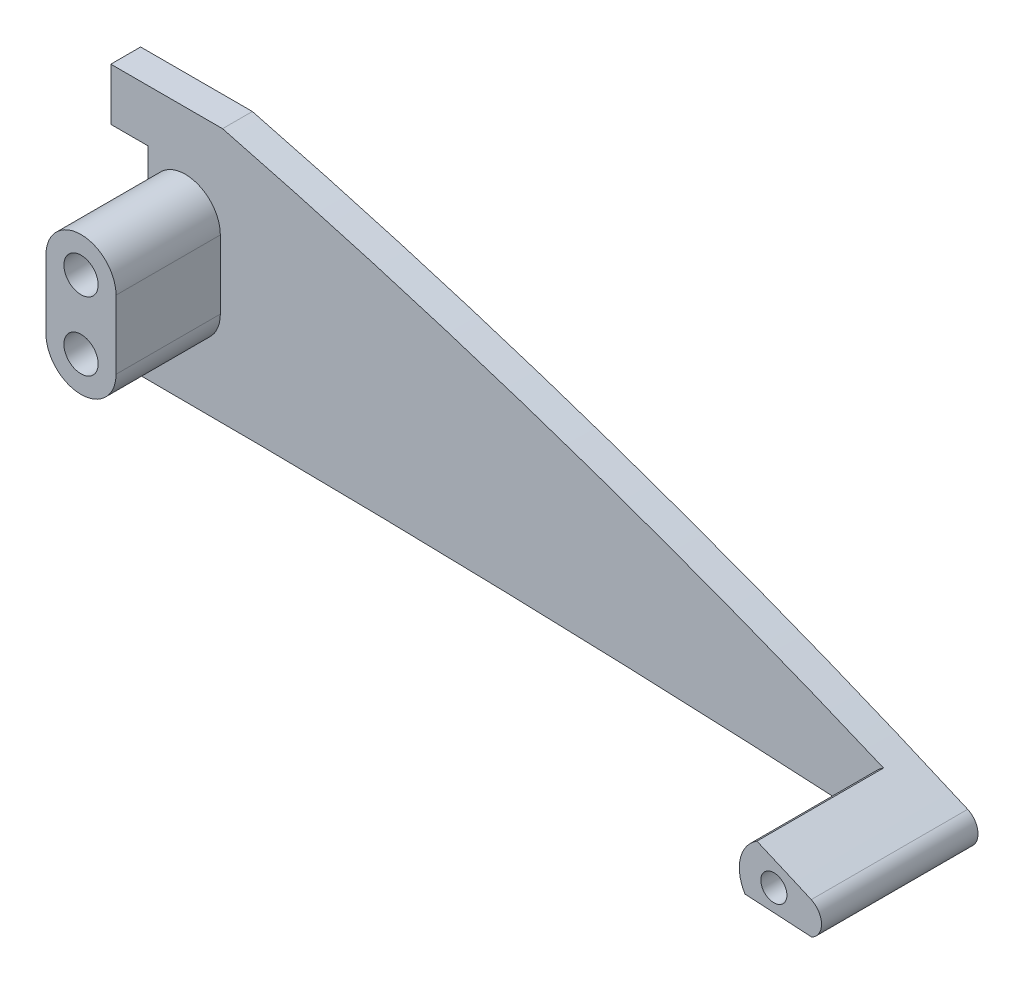
ISO-10303-21;
HEADER;
FILE_DESCRIPTION(('STEP AP214'),'2;1');
FILE_NAME('part.step','',(''),(''),'','','');
FILE_SCHEMA(('AUTOMOTIVE_DESIGN { 1 0 10303 214 1 1 1 1 }'));
ENDSEC;
DATA;
#1=APPLICATION_CONTEXT('core data for automotive mechanical design processes');
#2=APPLICATION_PROTOCOL_DEFINITION('international standard','automotive_design',2000,#1);
#3=PRODUCT_CONTEXT('',#1,'mechanical');
#4=PRODUCT('Part','Part','',(#3));
#5=PRODUCT_RELATED_PRODUCT_CATEGORY('part','',(#4));
#6=PRODUCT_DEFINITION_FORMATION('','',#4);
#7=PRODUCT_DEFINITION_CONTEXT('part definition',#1,'design');
#8=PRODUCT_DEFINITION('design','',#6,#7);
#9=PRODUCT_DEFINITION_SHAPE('','',#8);
#10=(LENGTH_UNIT() NAMED_UNIT(*) SI_UNIT(.MILLI.,.METRE.));
#11=(NAMED_UNIT(*) PLANE_ANGLE_UNIT() SI_UNIT($,.RADIAN.));
#12=(NAMED_UNIT(*) SI_UNIT($,.STERADIAN.) SOLID_ANGLE_UNIT());
#13=UNCERTAINTY_MEASURE_WITH_UNIT(LENGTH_MEASURE(1.E-05),#10,'distance_accuracy_value','');
#14=(GEOMETRIC_REPRESENTATION_CONTEXT(3) GLOBAL_UNCERTAINTY_ASSIGNED_CONTEXT((#13)) GLOBAL_UNIT_ASSIGNED_CONTEXT((#10,
#11,#12)) REPRESENTATION_CONTEXT('',''));
#15=CARTESIAN_POINT('',(0.,0.,0.));
#16=DIRECTION('',(0.,0.,1.));
#17=DIRECTION('',(1.,0.,0.));
#18=AXIS2_PLACEMENT_3D('',#15,#16,#17);
#19=CARTESIAN_POINT('',(125.2,-18.184180882781,4.));
#20=DIRECTION('',(0.,0.,-1.));
#21=DIRECTION('',(-1.,0.,0.));
#22=AXIS2_PLACEMENT_3D('',#19,#20,#21);
#23=PLANE('',#22);
#24=CARTESIAN_POINT('',(121.606035169385,-17.1322224625287,4.));
#25=DIRECTION('',(0.,0.,1.));
#26=DIRECTION('',(-1.,0.,0.));
#27=AXIS2_PLACEMENT_3D('',#24,#25,#26);
#28=CIRCLE('',#27,5.04570951350734);
#29=CARTESIAN_POINT('',(118.922411718287,-12.859360462951,4.));
#30=VERTEX_POINT('',#29);
#31=CARTESIAN_POINT('',(117.333173169808,-19.8158459136246,4.));
#32=VERTEX_POINT('',#31);
#33=EDGE_CURVE('E186',#30,#32,#28,.T.);
#34=ORIENTED_EDGE('',*,*,#33,.F.);
#35=CARTESIAN_POINT('',(-123.166643251558,-583.435959333798,4.));
#36=DIRECTION('',(0.,0.,1.));
#37=DIRECTION('',(-1.,0.,0.));
#38=AXIS2_PLACEMENT_3D('',#35,#36,#37);
#39=CIRCLE('',#38,619.810265900151);
#40=CARTESIAN_POINT('',(30.2000000000001,17.1000000000001,4.));
#41=VERTEX_POINT('',#40);
#42=EDGE_CURVE('E226',#30,#41,#39,.T.);
#43=ORIENTED_EDGE('',*,*,#42,.T.);
#44=DIRECTION('',(-1.,0.,0.));
#45=VECTOR('',#44,1.);
#46=CARTESIAN_POINT('',(15.2,17.1,4.));
#47=LINE('',#46,#45);
#48=CARTESIAN_POINT('',(15.2,17.1,4.));
#49=VERTEX_POINT('',#48);
#50=EDGE_CURVE('E229',#41,#49,#47,.T.);
#51=ORIENTED_EDGE('',*,*,#50,.T.);
#52=DIRECTION('',(0.,-1.,0.));
#53=VECTOR('',#52,1.);
#54=CARTESIAN_POINT('',(15.2,17.1,4.));
#55=LINE('',#54,#53);
#56=CARTESIAN_POINT('',(15.2,10.1,4.));
#57=VERTEX_POINT('',#56);
#58=EDGE_CURVE('E233',#49,#57,#55,.T.);
#59=ORIENTED_EDGE('',*,*,#58,.T.);
#60=DIRECTION('',(1.,0.,0.));
#61=VECTOR('',#60,1.);
#62=CARTESIAN_POINT('',(15.2,10.1,4.));
#63=LINE('',#62,#61);
#64=CARTESIAN_POINT('',(20.2,10.1,4.));
#65=VERTEX_POINT('',#64);
#66=EDGE_CURVE('E236',#57,#65,#63,.T.);
#67=ORIENTED_EDGE('',*,*,#66,.T.);
#68=DIRECTION('',(0.,-1.,0.));
#69=VECTOR('',#68,1.);
#70=CARTESIAN_POINT('',(20.2,10.1,4.));
#71=LINE('',#70,#69);
#72=CARTESIAN_POINT('',(20.2,-10.1,4.));
#73=VERTEX_POINT('',#72);
#74=EDGE_CURVE('E239',#65,#73,#71,.T.);
#75=ORIENTED_EDGE('',*,*,#74,.T.);
#76=DIRECTION('',(-1.,0.,0.));
#77=VECTOR('',#76,1.);
#78=CARTESIAN_POINT('',(15.2,-10.1,4.));
#79=LINE('',#78,#77);
#80=CARTESIAN_POINT('',(15.2,-10.1,4.));
#81=VERTEX_POINT('',#80);
#82=EDGE_CURVE('E242',#73,#81,#79,.T.);
#83=ORIENTED_EDGE('',*,*,#82,.T.);
#84=DIRECTION('',(0.,-1.,0.));
#85=VECTOR('',#84,1.);
#86=CARTESIAN_POINT('',(15.2,-10.1,4.));
#87=LINE('',#86,#85);
#88=CARTESIAN_POINT('',(15.2,-17.1,4.));
#89=VERTEX_POINT('',#88);
#90=EDGE_CURVE('E245',#81,#89,#87,.T.);
#91=ORIENTED_EDGE('',*,*,#90,.T.);
#92=DIRECTION('',(1.,0.,0.));
#93=VECTOR('',#92,1.);
#94=CARTESIAN_POINT('',(15.2,-17.1,4.));
#95=LINE('',#94,#93);
#96=CARTESIAN_POINT('',(19.1973795010615,-17.1000000000001,4.));
#97=VERTEX_POINT('',#96);
#98=EDGE_CURVE('E248',#89,#97,#95,.T.);
#99=ORIENTED_EDGE('',*,*,#98,.T.);
#100=CARTESIAN_POINT('',(19.1973795010577,-1791.50291617273,4.));
#101=DIRECTION('',(0.,0.,-1.));
#102=DIRECTION('',(-1.,0.,0.));
#103=AXIS2_PLACEMENT_3D('',#100,#101,#102);
#104=CIRCLE('',#103,1774.40291617273);
#105=EDGE_CURVE('E251',#97,#32,#104,.T.);
#106=ORIENTED_EDGE('',*,*,#105,.T.);
#107=EDGE_LOOP('',(#34,#43,#51,#59,#67,#75,#83,#91,#99,#106));
#108=FACE_BOUND('',#107,.T.);
#109=CARTESIAN_POINT('',(25.2,-4.6,4.));
#110=DIRECTION('',(0.,0.,1.));
#111=DIRECTION('',(1.,0.,0.));
#112=AXIS2_PLACEMENT_3D('',#109,#110,#111);
#113=CIRCLE('',#112,4.7);
#114=CARTESIAN_POINT('',(20.5,-4.6,4.));
#115=VERTEX_POINT('',#114);
#116=CARTESIAN_POINT('',(29.9,-4.6,4.));
#117=VERTEX_POINT('',#116);
#118=EDGE_CURVE('E178',#115,#117,#113,.T.);
#119=ORIENTED_EDGE('',*,*,#118,.F.);
#120=DIRECTION('',(0.,-1.,0.));
#121=VECTOR('',#120,1.);
#122=CARTESIAN_POINT('',(20.5,-4.6,4.));
#123=LINE('',#122,#121);
#124=CARTESIAN_POINT('',(20.5,4.6,4.));
#125=VERTEX_POINT('',#124);
#126=EDGE_CURVE('E175',#125,#115,#123,.T.);
#127=ORIENTED_EDGE('',*,*,#126,.F.);
#128=CARTESIAN_POINT('',(25.2,4.6,4.));
#129=DIRECTION('',(0.,0.,1.));
#130=DIRECTION('',(1.,0.,0.));
#131=AXIS2_PLACEMENT_3D('',#128,#129,#130);
#132=CIRCLE('',#131,4.7);
#133=CARTESIAN_POINT('',(29.9,4.6,4.));
#134=VERTEX_POINT('',#133);
#135=EDGE_CURVE('E63',#134,#125,#132,.T.);
#136=ORIENTED_EDGE('',*,*,#135,.F.);
#137=DIRECTION('',(0.,1.,0.));
#138=VECTOR('',#137,1.);
#139=CARTESIAN_POINT('',(29.9,-4.6,4.));
#140=LINE('',#139,#138);
#141=EDGE_CURVE('E58',#117,#134,#140,.T.);
#142=ORIENTED_EDGE('',*,*,#141,.F.);
#143=EDGE_LOOP('',(#119,#127,#136,#142));
#144=FACE_BOUND('',#143,.T.);
#145=ADVANCED_FACE('F40',(#108,#144),#23,.F.);
#146=CARTESIAN_POINT('',(125.2,-18.184180882781,0.));
#147=DIRECTION('',(0.,0.,-1.));
#148=DIRECTION('',(-1.,0.,0.));
#149=AXIS2_PLACEMENT_3D('',#146,#147,#148);
#150=PLANE('',#149);
#151=CARTESIAN_POINT('',(121.2,-17.1334379572921,0.));
#152=DIRECTION('',(0.,0.,-1.));
#153=DIRECTION('',(-1.,0.,0.));
#154=AXIS2_PLACEMENT_3D('',#151,#152,#153);
#155=CIRCLE('',#154,1.75);
#156=CARTESIAN_POINT('',(119.45,-17.1334379572921,0.));
#157=VERTEX_POINT('',#156);
#158=EDGE_CURVE('E320',#157,#157,#155,.T.);
#159=ORIENTED_EDGE('',*,*,#158,.F.);
#160=EDGE_LOOP('',(#159));
#161=FACE_BOUND('',#160,.T.);
#162=CARTESIAN_POINT('',(25.2,4.6,0.));
#163=DIRECTION('',(0.,0.,1.));
#164=DIRECTION('',(-1.,0.,0.));
#165=AXIS2_PLACEMENT_3D('',#162,#163,#164);
#166=CIRCLE('',#165,2.3);
#167=CARTESIAN_POINT('',(22.9,4.6,0.));
#168=VERTEX_POINT('',#167);
#169=EDGE_CURVE('E221',#168,#168,#166,.T.);
#170=ORIENTED_EDGE('',*,*,#169,.T.);
#171=EDGE_LOOP('',(#170));
#172=FACE_BOUND('',#171,.T.);
#173=CARTESIAN_POINT('',(125.2,-18.184180882781,0.));
#174=DIRECTION('',(0.,0.,1.));
#175=DIRECTION('',(-1.,0.,0.));
#176=AXIS2_PLACEMENT_3D('',#173,#174,#175);
#177=CIRCLE('',#176,2.40054797434142);
#178=CARTESIAN_POINT('',(126.269263580591,-20.3334379572921,0.));
#179=VERTEX_POINT('',#178);
#180=CARTESIAN_POINT('',(126.216652739476,-16.0095434912992,0.));
#181=VERTEX_POINT('',#180);
#182=EDGE_CURVE('E225',#179,#181,#177,.T.);
#183=ORIENTED_EDGE('',*,*,#182,.F.);
#184=CARTESIAN_POINT('',(19.1973795010577,-1791.50291617273,0.));
#185=DIRECTION('',(0.,0.,-1.));
#186=DIRECTION('',(-1.,0.,0.));
#187=AXIS2_PLACEMENT_3D('',#184,#185,#186);
#188=CIRCLE('',#187,1774.40291617273);
#189=CARTESIAN_POINT('',(19.1973795010615,-17.1000000000001,0.));
#190=VERTEX_POINT('',#189);
#191=EDGE_CURVE('E230',#190,#179,#188,.T.);
#192=ORIENTED_EDGE('',*,*,#191,.F.);
#193=DIRECTION('',(1.,0.,0.));
#194=VECTOR('',#193,1.);
#195=CARTESIAN_POINT('',(15.2,-17.1,0.));
#196=LINE('',#195,#194);
#197=CARTESIAN_POINT('',(15.2,-17.1,0.));
#198=VERTEX_POINT('',#197);
#199=EDGE_CURVE('E279',#198,#190,#196,.T.);
#200=ORIENTED_EDGE('',*,*,#199,.F.);
#201=DIRECTION('',(0.,-1.,0.));
#202=VECTOR('',#201,1.);
#203=CARTESIAN_POINT('',(15.2,-10.1,0.));
#204=LINE('',#203,#202);
#205=CARTESIAN_POINT('',(15.2,-10.1,0.));
#206=VERTEX_POINT('',#205);
#207=EDGE_CURVE('E276',#206,#198,#204,.T.);
#208=ORIENTED_EDGE('',*,*,#207,.F.);
#209=DIRECTION('',(-1.,0.,0.));
#210=VECTOR('',#209,1.);
#211=CARTESIAN_POINT('',(15.2,-10.1,0.));
#212=LINE('',#211,#210);
#213=CARTESIAN_POINT('',(20.2,-10.1,0.));
#214=VERTEX_POINT('',#213);
#215=EDGE_CURVE('E273',#214,#206,#212,.T.);
#216=ORIENTED_EDGE('',*,*,#215,.F.);
#217=DIRECTION('',(0.,-1.,0.));
#218=VECTOR('',#217,1.);
#219=CARTESIAN_POINT('',(20.2,10.1,0.));
#220=LINE('',#219,#218);
#221=CARTESIAN_POINT('',(20.2,10.1,0.));
#222=VERTEX_POINT('',#221);
#223=EDGE_CURVE('E270',#222,#214,#220,.T.);
#224=ORIENTED_EDGE('',*,*,#223,.F.);
#225=DIRECTION('',(1.,0.,0.));
#226=VECTOR('',#225,1.);
#227=CARTESIAN_POINT('',(15.2,10.1,0.));
#228=LINE('',#227,#226);
#229=CARTESIAN_POINT('',(15.2,10.1,0.));
#230=VERTEX_POINT('',#229);
#231=EDGE_CURVE('E267',#230,#222,#228,.T.);
#232=ORIENTED_EDGE('',*,*,#231,.F.);
#233=DIRECTION('',(0.,-1.,0.));
#234=VECTOR('',#233,1.);
#235=CARTESIAN_POINT('',(15.2,17.1,0.));
#236=LINE('',#235,#234);
#237=CARTESIAN_POINT('',(15.2,17.1,0.));
#238=VERTEX_POINT('',#237);
#239=EDGE_CURVE('E264',#238,#230,#236,.T.);
#240=ORIENTED_EDGE('',*,*,#239,.F.);
#241=DIRECTION('',(-1.,0.,0.));
#242=VECTOR('',#241,1.);
#243=CARTESIAN_POINT('',(15.2,17.1,0.));
#244=LINE('',#243,#242);
#245=CARTESIAN_POINT('',(30.2000000000001,17.1000000000001,0.));
#246=VERTEX_POINT('',#245);
#247=EDGE_CURVE('E261',#246,#238,#244,.T.);
#248=ORIENTED_EDGE('',*,*,#247,.F.);
#249=CARTESIAN_POINT('',(-123.166643251558,-583.435959333798,0.));
#250=DIRECTION('',(0.,0.,1.));
#251=DIRECTION('',(-1.,0.,0.));
#252=AXIS2_PLACEMENT_3D('',#249,#250,#251);
#253=CIRCLE('',#252,619.810265900151);
#254=EDGE_CURVE('E258',#181,#246,#253,.T.);
#255=ORIENTED_EDGE('',*,*,#254,.F.);
#256=EDGE_LOOP('',(#183,#192,#200,#208,#216,#224,#232,#240,#248,#255));
#257=FACE_BOUND('',#256,.T.);
#258=CARTESIAN_POINT('',(25.2,-4.6,0.));
#259=DIRECTION('',(0.,0.,1.));
#260=DIRECTION('',(1.,0.,0.));
#261=AXIS2_PLACEMENT_3D('',#258,#259,#260);
#262=CIRCLE('',#261,2.3);
#263=CARTESIAN_POINT('',(27.5,-4.6,0.));
#264=VERTEX_POINT('',#263);
#265=EDGE_CURVE('E217',#264,#264,#262,.T.);
#266=ORIENTED_EDGE('',*,*,#265,.T.);
#267=EDGE_LOOP('',(#266));
#268=FACE_BOUND('',#267,.T.);
#269=ADVANCED_FACE('F365',(#161,#172,#257,#268),#150,.T.);
#270=CARTESIAN_POINT('',(125.2,-18.184180882781,4.));
#271=DIRECTION('',(0.,0.,-1.));
#272=DIRECTION('',(-1.,0.,0.));
#273=AXIS2_PLACEMENT_3D('',#270,#271,#272);
#274=CYLINDRICAL_SURFACE('',#273,2.40054797434142);
#275=ORIENTED_EDGE('',*,*,#182,.T.);
#276=DIRECTION('',(0.,0.,-1.));
#277=VECTOR('',#276,1.);
#278=CARTESIAN_POINT('',(126.216652739476,-16.0095434912992,4.));
#279=LINE('',#278,#277);
#280=CARTESIAN_POINT('',(126.216652739476,-16.0095434912992,21.));
#281=VERTEX_POINT('',#280);
#282=EDGE_CURVE('E11',#281,#181,#279,.T.);
#283=ORIENTED_EDGE('',*,*,#282,.F.);
#284=CARTESIAN_POINT('',(125.2,-18.184180882781,21.));
#285=DIRECTION('',(0.,0.,1.));
#286=DIRECTION('',(1.,0.,0.));
#287=AXIS2_PLACEMENT_3D('',#284,#285,#286);
#288=CIRCLE('',#287,2.40054797434144);
#289=CARTESIAN_POINT('',(126.269263580591,-20.3334379572921,21.));
#290=VERTEX_POINT('',#289);
#291=EDGE_CURVE('E192',#290,#281,#288,.T.);
#292=ORIENTED_EDGE('',*,*,#291,.F.);
#293=DIRECTION('',(0.,0.,-1.));
#294=VECTOR('',#293,1.);
#295=CARTESIAN_POINT('',(126.269263580591,-20.3334379572921,4.));
#296=LINE('',#295,#294);
#297=EDGE_CURVE('E254',#290,#179,#296,.T.);
#298=ORIENTED_EDGE('',*,*,#297,.T.);
#299=EDGE_LOOP('',(#275,#283,#292,#298));
#300=FACE_BOUND('',#299,.T.);
#301=ADVANCED_FACE('F42',(#300),#274,.T.);
#302=CARTESIAN_POINT('',(-123.166643251558,-583.435959333798,4.));
#303=DIRECTION('',(0.,0.,-1.));
#304=DIRECTION('',(-1.,0.,0.));
#305=AXIS2_PLACEMENT_3D('',#302,#303,#304);
#306=CYLINDRICAL_SURFACE('',#305,619.810265900151);
#307=ORIENTED_EDGE('',*,*,#254,.T.);
#308=DIRECTION('',(0.,0.,-1.));
#309=VECTOR('',#308,1.);
#310=CARTESIAN_POINT('',(30.2000000000001,17.1000000000001,4.));
#311=LINE('',#310,#309);
#312=EDGE_CURVE('E50',#41,#246,#311,.T.);
#313=ORIENTED_EDGE('',*,*,#312,.F.);
#314=ORIENTED_EDGE('',*,*,#42,.F.);
#315=DIRECTION('',(0.,0.,-1.));
#316=VECTOR('',#315,1.);
#317=CARTESIAN_POINT('',(118.922411718289,-12.859360462952,21.));
#318=LINE('',#317,#316);
#319=CARTESIAN_POINT('',(118.922411718289,-12.859360462952,21.));
#320=VERTEX_POINT('',#319);
#321=EDGE_CURVE('E213',#320,#30,#318,.T.);
#322=ORIENTED_EDGE('',*,*,#321,.F.);
#323=CARTESIAN_POINT('',(-123.166643251558,-583.435959333798,21.));
#324=DIRECTION('',(0.,0.,1.));
#325=DIRECTION('',(1.,0.,0.));
#326=AXIS2_PLACEMENT_3D('',#323,#324,#325);
#327=CIRCLE('',#326,619.810265900151);
#328=EDGE_CURVE('E196',#281,#320,#327,.T.);
#329=ORIENTED_EDGE('',*,*,#328,.F.);
#330=ORIENTED_EDGE('',*,*,#282,.T.);
#331=EDGE_LOOP('',(#307,#313,#314,#322,#329,#330));
#332=FACE_BOUND('',#331,.T.);
#333=ADVANCED_FACE('F407',(#332),#306,.T.);
#334=CARTESIAN_POINT('',(15.2,17.1,4.));
#335=DIRECTION('',(0.,-1.,0.));
#336=DIRECTION('',(0.,0.,-1.));
#337=AXIS2_PLACEMENT_3D('',#334,#335,#336);
#338=PLANE('',#337);
#339=ORIENTED_EDGE('',*,*,#247,.T.);
#340=DIRECTION('',(0.,0.,-1.));
#341=VECTOR('',#340,1.);
#342=CARTESIAN_POINT('',(15.2,17.1,4.));
#343=LINE('',#342,#341);
#344=EDGE_CURVE('E311',#49,#238,#343,.T.);
#345=ORIENTED_EDGE('',*,*,#344,.F.);
#346=ORIENTED_EDGE('',*,*,#50,.F.);
#347=ORIENTED_EDGE('',*,*,#312,.T.);
#348=EDGE_LOOP('',(#339,#345,#346,#347));
#349=FACE_BOUND('',#348,.T.);
#350=ADVANCED_FACE('F404',(#349),#338,.F.);
#351=CARTESIAN_POINT('',(15.2,17.1,4.));
#352=DIRECTION('',(1.,0.,0.));
#353=DIRECTION('',(0.,1.,0.));
#354=AXIS2_PLACEMENT_3D('',#351,#352,#353);
#355=PLANE('',#354);
#356=ORIENTED_EDGE('',*,*,#239,.T.);
#357=DIRECTION('',(0.,0.,-1.));
#358=VECTOR('',#357,1.);
#359=CARTESIAN_POINT('',(15.2,10.1,4.));
#360=LINE('',#359,#358);
#361=EDGE_CURVE('E307',#57,#230,#360,.T.);
#362=ORIENTED_EDGE('',*,*,#361,.F.);
#363=ORIENTED_EDGE('',*,*,#58,.F.);
#364=ORIENTED_EDGE('',*,*,#344,.T.);
#365=EDGE_LOOP('',(#356,#362,#363,#364));
#366=FACE_BOUND('',#365,.T.);
#367=ADVANCED_FACE('F400',(#366),#355,.F.);
#368=CARTESIAN_POINT('',(15.2,10.1,4.));
#369=DIRECTION('',(0.,1.,0.));
#370=DIRECTION('',(0.,0.,1.));
#371=AXIS2_PLACEMENT_3D('',#368,#369,#370);
#372=PLANE('',#371);
#373=ORIENTED_EDGE('',*,*,#231,.T.);
#374=DIRECTION('',(0.,0.,-1.));
#375=VECTOR('',#374,1.);
#376=CARTESIAN_POINT('',(20.2,10.1,4.));
#377=LINE('',#376,#375);
#378=EDGE_CURVE('E303',#65,#222,#377,.T.);
#379=ORIENTED_EDGE('',*,*,#378,.F.);
#380=ORIENTED_EDGE('',*,*,#66,.F.);
#381=ORIENTED_EDGE('',*,*,#361,.T.);
#382=EDGE_LOOP('',(#373,#379,#380,#381));
#383=FACE_BOUND('',#382,.T.);
#384=ADVANCED_FACE('F396',(#383),#372,.F.);
#385=CARTESIAN_POINT('',(20.2,10.1,4.));
#386=DIRECTION('',(1.,0.,0.));
#387=DIRECTION('',(0.,0.,-1.));
#388=AXIS2_PLACEMENT_3D('',#385,#386,#387);
#389=PLANE('',#388);
#390=ORIENTED_EDGE('',*,*,#223,.T.);
#391=DIRECTION('',(0.,0.,-1.));
#392=VECTOR('',#391,1.);
#393=CARTESIAN_POINT('',(20.2,-10.1,4.));
#394=LINE('',#393,#392);
#395=EDGE_CURVE('E299',#73,#214,#394,.T.);
#396=ORIENTED_EDGE('',*,*,#395,.F.);
#397=ORIENTED_EDGE('',*,*,#74,.F.);
#398=ORIENTED_EDGE('',*,*,#378,.T.);
#399=EDGE_LOOP('',(#390,#396,#397,#398));
#400=FACE_BOUND('',#399,.T.);
#401=ADVANCED_FACE('F392',(#400),#389,.F.);
#402=CARTESIAN_POINT('',(15.2,-10.1,4.));
#403=DIRECTION('',(0.,-1.,0.));
#404=DIRECTION('',(1.,0.,0.));
#405=AXIS2_PLACEMENT_3D('',#402,#403,#404);
#406=PLANE('',#405);
#407=ORIENTED_EDGE('',*,*,#215,.T.);
#408=DIRECTION('',(0.,0.,-1.));
#409=VECTOR('',#408,1.);
#410=CARTESIAN_POINT('',(15.2,-10.1,4.));
#411=LINE('',#410,#409);
#412=EDGE_CURVE('E295',#81,#206,#411,.T.);
#413=ORIENTED_EDGE('',*,*,#412,.F.);
#414=ORIENTED_EDGE('',*,*,#82,.F.);
#415=ORIENTED_EDGE('',*,*,#395,.T.);
#416=EDGE_LOOP('',(#407,#413,#414,#415));
#417=FACE_BOUND('',#416,.T.);
#418=ADVANCED_FACE('F388',(#417),#406,.F.);
#419=CARTESIAN_POINT('',(15.2,-10.1,4.));
#420=DIRECTION('',(1.,0.,0.));
#421=DIRECTION('',(0.,1.,0.));
#422=AXIS2_PLACEMENT_3D('',#419,#420,#421);
#423=PLANE('',#422);
#424=ORIENTED_EDGE('',*,*,#207,.T.);
#425=DIRECTION('',(0.,0.,-1.));
#426=VECTOR('',#425,1.);
#427=CARTESIAN_POINT('',(15.2,-17.1,4.));
#428=LINE('',#427,#426);
#429=EDGE_CURVE('E291',#89,#198,#428,.T.);
#430=ORIENTED_EDGE('',*,*,#429,.F.);
#431=ORIENTED_EDGE('',*,*,#90,.F.);
#432=ORIENTED_EDGE('',*,*,#412,.T.);
#433=EDGE_LOOP('',(#424,#430,#431,#432));
#434=FACE_BOUND('',#433,.T.);
#435=ADVANCED_FACE('F384',(#434),#423,.F.);
#436=CARTESIAN_POINT('',(15.2,-17.1,4.));
#437=DIRECTION('',(0.,1.,0.));
#438=DIRECTION('',(-1.,0.,0.));
#439=AXIS2_PLACEMENT_3D('',#436,#437,#438);
#440=PLANE('',#439);
#441=ORIENTED_EDGE('',*,*,#199,.T.);
#442=DIRECTION('',(0.,0.,-1.));
#443=VECTOR('',#442,1.);
#444=CARTESIAN_POINT('',(19.1973795010615,-17.1000000000001,4.));
#445=LINE('',#444,#443);
#446=EDGE_CURVE('E287',#97,#190,#445,.T.);
#447=ORIENTED_EDGE('',*,*,#446,.F.);
#448=ORIENTED_EDGE('',*,*,#98,.F.);
#449=ORIENTED_EDGE('',*,*,#429,.T.);
#450=EDGE_LOOP('',(#441,#447,#448,#449));
#451=FACE_BOUND('',#450,.T.);
#452=ADVANCED_FACE('F380',(#451),#440,.F.);
#453=CARTESIAN_POINT('',(19.1973795010577,-1791.50291617273,4.));
#454=DIRECTION('',(0.,0.,-1.));
#455=DIRECTION('',(-1.,0.,0.));
#456=AXIS2_PLACEMENT_3D('',#453,#454,#455);
#457=CYLINDRICAL_SURFACE('',#456,1774.40291617273);
#458=ORIENTED_EDGE('',*,*,#191,.T.);
#459=ORIENTED_EDGE('',*,*,#297,.F.);
#460=CARTESIAN_POINT('',(19.1973795010577,-1791.50291617273,21.));
#461=DIRECTION('',(0.,0.,-1.));
#462=DIRECTION('',(1.,0.,0.));
#463=AXIS2_PLACEMENT_3D('',#460,#461,#462);
#464=CIRCLE('',#463,1774.40291617273);
#465=CARTESIAN_POINT('',(117.333173169808,-19.8158459136246,21.));
#466=VERTEX_POINT('',#465);
#467=EDGE_CURVE('E202',#466,#290,#464,.T.);
#468=ORIENTED_EDGE('',*,*,#467,.F.);
#469=DIRECTION('',(0.,0.,-1.));
#470=VECTOR('',#469,1.);
#471=CARTESIAN_POINT('',(117.333173169808,-19.8158459136246,21.));
#472=LINE('',#471,#470);
#473=EDGE_CURVE('E206',#466,#32,#472,.T.);
#474=ORIENTED_EDGE('',*,*,#473,.T.);
#475=ORIENTED_EDGE('',*,*,#105,.F.);
#476=ORIENTED_EDGE('',*,*,#446,.T.);
#477=EDGE_LOOP('',(#458,#459,#468,#474,#475,#476));
#478=FACE_BOUND('',#477,.T.);
#479=ADVANCED_FACE('F377',(#478),#457,.F.);
#480=CARTESIAN_POINT('',(25.2,4.6,4.));
#481=DIRECTION('',(0.,0.,-1.));
#482=DIRECTION('',(-1.,0.,0.));
#483=AXIS2_PLACEMENT_3D('',#480,#481,#482);
#484=CYLINDRICAL_SURFACE('',#483,2.3);
#485=ORIENTED_EDGE('',*,*,#169,.F.);
#486=EDGE_LOOP('',(#485));
#487=FACE_BOUND('',#486,.T.);
#488=CARTESIAN_POINT('',(25.2,4.6,18.));
#489=DIRECTION('',(0.,0.,1.));
#490=DIRECTION('',(1.,0.,0.));
#491=AXIS2_PLACEMENT_3D('',#488,#489,#490);
#492=CIRCLE('',#491,2.3);
#493=CARTESIAN_POINT('',(27.5,4.6,18.));
#494=VERTEX_POINT('',#493);
#495=EDGE_CURVE('E44',#494,#494,#492,.T.);
#496=ORIENTED_EDGE('',*,*,#495,.T.);
#497=EDGE_LOOP('',(#496));
#498=FACE_BOUND('',#497,.T.);
#499=ADVANCED_FACE('F374',(#487,#498),#484,.F.);
#500=CARTESIAN_POINT('',(25.2,-4.6,4.));
#501=DIRECTION('',(0.,0.,-1.));
#502=DIRECTION('',(-1.,0.,0.));
#503=AXIS2_PLACEMENT_3D('',#500,#501,#502);
#504=CYLINDRICAL_SURFACE('',#503,2.3);
#505=ORIENTED_EDGE('',*,*,#265,.F.);
#506=EDGE_LOOP('',(#505));
#507=FACE_BOUND('',#506,.T.);
#508=CARTESIAN_POINT('',(25.2,-4.6,18.));
#509=DIRECTION('',(0.,0.,1.));
#510=DIRECTION('',(1.,0.,0.));
#511=AXIS2_PLACEMENT_3D('',#508,#509,#510);
#512=CIRCLE('',#511,2.3);
#513=CARTESIAN_POINT('',(27.5,-4.6,18.));
#514=VERTEX_POINT('',#513);
#515=EDGE_CURVE('E317',#514,#514,#512,.T.);
#516=ORIENTED_EDGE('',*,*,#515,.T.);
#517=EDGE_LOOP('',(#516));
#518=FACE_BOUND('',#517,.T.);
#519=ADVANCED_FACE('F455',(#507,#518),#504,.F.);
#520=CARTESIAN_POINT('',(1.01667837422106,-300.81007010829,21.));
#521=DIRECTION('',(0.,0.,1.));
#522=DIRECTION('',(1.,0.,0.));
#523=AXIS2_PLACEMENT_3D('',#520,#521,#522);
#524=PLANE('',#523);
#525=ORIENTED_EDGE('',*,*,#291,.T.);
#526=ORIENTED_EDGE('',*,*,#328,.T.);
#527=CARTESIAN_POINT('',(121.606035169385,-17.1322224625287,21.));
#528=DIRECTION('',(0.,0.,1.));
#529=DIRECTION('',(-1.,0.,0.));
#530=AXIS2_PLACEMENT_3D('',#527,#528,#529);
#531=CIRCLE('',#530,5.04570951350734);
#532=EDGE_CURVE('E199',#320,#466,#531,.T.);
#533=ORIENTED_EDGE('',*,*,#532,.T.);
#534=ORIENTED_EDGE('',*,*,#467,.T.);
#535=EDGE_LOOP('',(#525,#526,#533,#534));
#536=FACE_BOUND('',#535,.T.);
#537=CARTESIAN_POINT('',(121.2,-17.1334379572921,21.));
#538=DIRECTION('',(0.,0.,1.));
#539=DIRECTION('',(1.,0.,0.));
#540=AXIS2_PLACEMENT_3D('',#537,#538,#539);
#541=CIRCLE('',#540,1.75);
#542=CARTESIAN_POINT('',(122.95,-17.1334379572921,21.));
#543=VERTEX_POINT('',#542);
#544=EDGE_CURVE('E180',#543,#543,#541,.T.);
#545=ORIENTED_EDGE('',*,*,#544,.F.);
#546=EDGE_LOOP('',(#545));
#547=FACE_BOUND('',#546,.T.);
#548=ADVANCED_FACE('F440',(#536,#547),#524,.T.);
#549=CARTESIAN_POINT('',(121.606035169385,-17.1322224625287,21.));
#550=DIRECTION('',(0.,0.,-1.));
#551=DIRECTION('',(-1.,0.,0.));
#552=AXIS2_PLACEMENT_3D('',#549,#550,#551);
#553=CYLINDRICAL_SURFACE('',#552,5.04570951350734);
#554=ORIENTED_EDGE('',*,*,#33,.T.);
#555=ORIENTED_EDGE('',*,*,#473,.F.);
#556=ORIENTED_EDGE('',*,*,#532,.F.);
#557=ORIENTED_EDGE('',*,*,#321,.T.);
#558=EDGE_LOOP('',(#554,#555,#556,#557));
#559=FACE_BOUND('',#558,.T.);
#560=ADVANCED_FACE('F436',(#559),#553,.T.);
#561=CARTESIAN_POINT('',(121.2,-17.1334379572921,21.));
#562=DIRECTION('',(0.,0.,-1.));
#563=DIRECTION('',(-1.,0.,0.));
#564=AXIS2_PLACEMENT_3D('',#561,#562,#563);
#565=CYLINDRICAL_SURFACE('',#564,1.75);
#566=ORIENTED_EDGE('',*,*,#544,.T.);
#567=EDGE_LOOP('',(#566));
#568=FACE_BOUND('',#567,.T.);
#569=ORIENTED_EDGE('',*,*,#158,.T.);
#570=EDGE_LOOP('',(#569));
#571=FACE_BOUND('',#570,.T.);
#572=ADVANCED_FACE('F459',(#568,#571),#565,.F.);
#573=CARTESIAN_POINT('',(25.2,-4.6,18.));
#574=DIRECTION('',(0.,0.,-1.));
#575=DIRECTION('',(-1.,0.,0.));
#576=AXIS2_PLACEMENT_3D('',#573,#574,#575);
#577=CYLINDRICAL_SURFACE('',#576,4.7);
#578=ORIENTED_EDGE('',*,*,#118,.T.);
#579=DIRECTION('',(0.,0.,-1.));
#580=VECTOR('',#579,1.);
#581=CARTESIAN_POINT('',(29.9,-4.6,18.));
#582=LINE('',#581,#580);
#583=CARTESIAN_POINT('',(29.9,-4.6,18.));
#584=VERTEX_POINT('',#583);
#585=EDGE_CURVE('E157',#584,#117,#582,.T.);
#586=ORIENTED_EDGE('',*,*,#585,.F.);
#587=CARTESIAN_POINT('',(25.2,-4.6,18.));
#588=DIRECTION('',(0.,0.,1.));
#589=DIRECTION('',(1.,0.,0.));
#590=AXIS2_PLACEMENT_3D('',#587,#588,#589);
#591=CIRCLE('',#590,4.7);
#592=CARTESIAN_POINT('',(20.5,-4.6,18.));
#593=VERTEX_POINT('',#592);
#594=EDGE_CURVE('E165',#593,#584,#591,.T.);
#595=ORIENTED_EDGE('',*,*,#594,.F.);
#596=DIRECTION('',(0.,0.,-1.));
#597=VECTOR('',#596,1.);
#598=CARTESIAN_POINT('',(20.5,-4.6,18.));
#599=LINE('',#598,#597);
#600=EDGE_CURVE('E337',#593,#115,#599,.T.);
#601=ORIENTED_EDGE('',*,*,#600,.T.);
#602=EDGE_LOOP('',(#578,#586,#595,#601));
#603=FACE_BOUND('',#602,.T.);
#604=ADVANCED_FACE('F177',(#603),#577,.T.);
#605=CARTESIAN_POINT('',(29.9,-4.6,18.));
#606=DIRECTION('',(-1.,0.,0.));
#607=DIRECTION('',(0.,0.,1.));
#608=AXIS2_PLACEMENT_3D('',#605,#606,#607);
#609=PLANE('',#608);
#610=ORIENTED_EDGE('',*,*,#141,.T.);
#611=DIRECTION('',(0.,0.,-1.));
#612=VECTOR('',#611,1.);
#613=CARTESIAN_POINT('',(29.9,4.6,18.));
#614=LINE('',#613,#612);
#615=CARTESIAN_POINT('',(29.9,4.6,18.));
#616=VERTEX_POINT('',#615);
#617=EDGE_CURVE('E160',#616,#134,#614,.T.);
#618=ORIENTED_EDGE('',*,*,#617,.F.);
#619=DIRECTION('',(0.,1.,0.));
#620=VECTOR('',#619,1.);
#621=CARTESIAN_POINT('',(29.9,-4.6,18.));
#622=LINE('',#621,#620);
#623=EDGE_CURVE('E153',#584,#616,#622,.T.);
#624=ORIENTED_EDGE('',*,*,#623,.F.);
#625=ORIENTED_EDGE('',*,*,#585,.T.);
#626=EDGE_LOOP('',(#610,#618,#624,#625));
#627=FACE_BOUND('',#626,.T.);
#628=ADVANCED_FACE('F155',(#627),#609,.F.);
#629=CARTESIAN_POINT('',(25.2,4.6,18.));
#630=DIRECTION('',(0.,0.,-1.));
#631=DIRECTION('',(-1.,0.,0.));
#632=AXIS2_PLACEMENT_3D('',#629,#630,#631);
#633=CYLINDRICAL_SURFACE('',#632,4.7);
#634=ORIENTED_EDGE('',*,*,#135,.T.);
#635=DIRECTION('',(0.,0.,-1.));
#636=VECTOR('',#635,1.);
#637=CARTESIAN_POINT('',(20.5,4.6,18.));
#638=LINE('',#637,#636);
#639=CARTESIAN_POINT('',(20.5,4.6,18.));
#640=VERTEX_POINT('',#639);
#641=EDGE_CURVE('E188',#640,#125,#638,.T.);
#642=ORIENTED_EDGE('',*,*,#641,.F.);
#643=CARTESIAN_POINT('',(25.2,4.6,18.));
#644=DIRECTION('',(0.,0.,1.));
#645=DIRECTION('',(1.,0.,0.));
#646=AXIS2_PLACEMENT_3D('',#643,#644,#645);
#647=CIRCLE('',#646,4.7);
#648=EDGE_CURVE('E164',#616,#640,#647,.T.);
#649=ORIENTED_EDGE('',*,*,#648,.F.);
#650=ORIENTED_EDGE('',*,*,#617,.T.);
#651=EDGE_LOOP('',(#634,#642,#649,#650));
#652=FACE_BOUND('',#651,.T.);
#653=ADVANCED_FACE('F355',(#652),#633,.T.);
#654=CARTESIAN_POINT('',(20.5,-4.6,18.));
#655=DIRECTION('',(1.,0.,0.));
#656=DIRECTION('',(0.,0.,-1.));
#657=AXIS2_PLACEMENT_3D('',#654,#655,#656);
#658=PLANE('',#657);
#659=ORIENTED_EDGE('',*,*,#126,.T.);
#660=ORIENTED_EDGE('',*,*,#600,.F.);
#661=DIRECTION('',(0.,-1.,0.));
#662=VECTOR('',#661,1.);
#663=CARTESIAN_POINT('',(20.5,-4.6,18.));
#664=LINE('',#663,#662);
#665=EDGE_CURVE('E170',#640,#593,#664,.T.);
#666=ORIENTED_EDGE('',*,*,#665,.F.);
#667=ORIENTED_EDGE('',*,*,#641,.T.);
#668=EDGE_LOOP('',(#659,#660,#666,#667));
#669=FACE_BOUND('',#668,.T.);
#670=ADVANCED_FACE('F353',(#669),#658,.F.);
#671=CARTESIAN_POINT('',(25.2,-4.6,18.));
#672=DIRECTION('',(0.,0.,1.));
#673=DIRECTION('',(1.,0.,0.));
#674=AXIS2_PLACEMENT_3D('',#671,#672,#673);
#675=PLANE('',#674);
#676=ORIENTED_EDGE('',*,*,#495,.F.);
#677=EDGE_LOOP('',(#676));
#678=FACE_BOUND('',#677,.T.);
#679=ORIENTED_EDGE('',*,*,#515,.F.);
#680=EDGE_LOOP('',(#679));
#681=FACE_BOUND('',#680,.T.);
#682=ORIENTED_EDGE('',*,*,#594,.T.);
#683=ORIENTED_EDGE('',*,*,#623,.T.);
#684=ORIENTED_EDGE('',*,*,#648,.T.);
#685=ORIENTED_EDGE('',*,*,#665,.T.);
#686=EDGE_LOOP('',(#682,#683,#684,#685));
#687=FACE_BOUND('',#686,.T.);
#688=ADVANCED_FACE('F168',(#678,#681,#687),#675,.T.);
#689=CLOSED_SHELL('',(#145,#269,#301,#333,#350,#367,#384,#401,#418,#435,#452,#479,#499,#519,
#548,#560,#572,#604,#628,#653,#670,#688));
#690=MANIFOLD_SOLID_BREP('B2',#689);
#691=ADVANCED_BREP_SHAPE_REPRESENTATION('',(#18,#690),#14);
#692=SHAPE_DEFINITION_REPRESENTATION(#9,#691);
ENDSEC;
END-ISO-10303-21;
